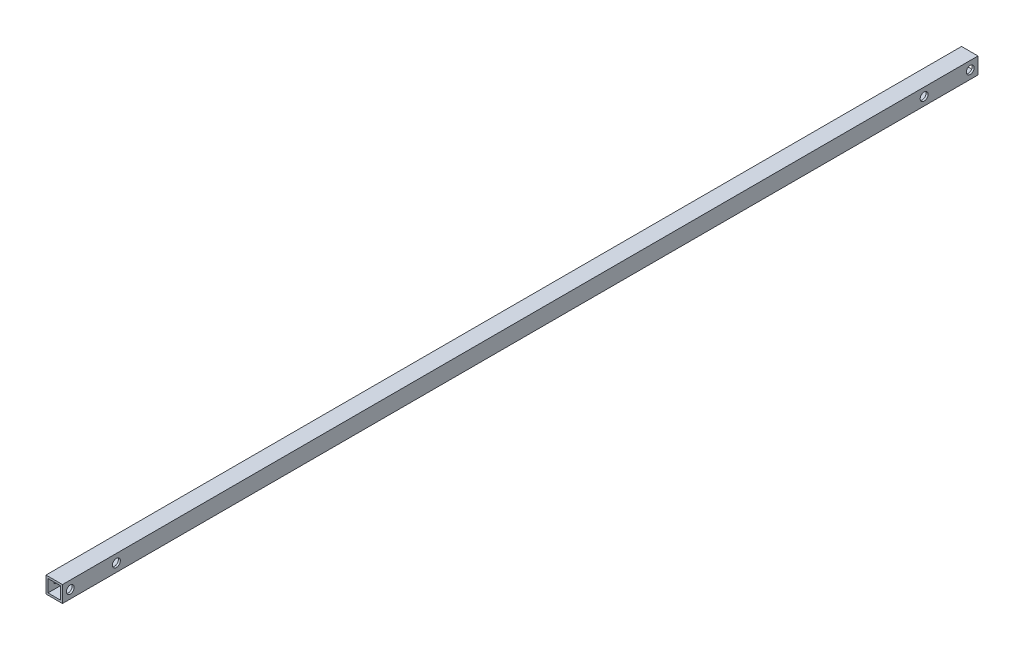
ISO-10303-21;
HEADER;
FILE_DESCRIPTION(('STEP AP214'),'2;1');
FILE_NAME('part.step','',(''),(''),'','','');
FILE_SCHEMA(('AUTOMOTIVE_DESIGN { 1 0 10303 214 1 1 1 1 }'));
ENDSEC;
DATA;
#1=APPLICATION_CONTEXT('core data for automotive mechanical design processes');
#2=APPLICATION_PROTOCOL_DEFINITION('international standard','automotive_design',2000,#1);
#3=PRODUCT_CONTEXT('',#1,'mechanical');
#4=PRODUCT('Part','Part','',(#3));
#5=PRODUCT_RELATED_PRODUCT_CATEGORY('part','',(#4));
#6=PRODUCT_DEFINITION_FORMATION('','',#4);
#7=PRODUCT_DEFINITION_CONTEXT('part definition',#1,'design');
#8=PRODUCT_DEFINITION('design','',#6,#7);
#9=PRODUCT_DEFINITION_SHAPE('','',#8);
#10=(LENGTH_UNIT() NAMED_UNIT(*) SI_UNIT(.MILLI.,.METRE.));
#11=(NAMED_UNIT(*) PLANE_ANGLE_UNIT() SI_UNIT($,.RADIAN.));
#12=(NAMED_UNIT(*) SI_UNIT($,.STERADIAN.) SOLID_ANGLE_UNIT());
#13=UNCERTAINTY_MEASURE_WITH_UNIT(LENGTH_MEASURE(1.E-05),#10,'distance_accuracy_value','');
#14=(GEOMETRIC_REPRESENTATION_CONTEXT(3) GLOBAL_UNCERTAINTY_ASSIGNED_CONTEXT((#13)) GLOBAL_UNIT_ASSIGNED_CONTEXT((#10,
#11,#12)) REPRESENTATION_CONTEXT('',''));
#15=CARTESIAN_POINT('',(0.,0.,0.));
#16=DIRECTION('',(0.,0.,1.));
#17=DIRECTION('',(1.,0.,0.));
#18=AXIS2_PLACEMENT_3D('',#15,#16,#17);
#19=CARTESIAN_POINT('',(0.,-25.,1390.));
#20=DIRECTION('',(0.,0.,1.));
#21=DIRECTION('',(1.,0.,0.));
#22=AXIS2_PLACEMENT_3D('',#19,#20,#21);
#23=PLANE('',#22);
#24=DIRECTION('',(0.,-1.,0.));
#25=VECTOR('',#24,1.);
#26=CARTESIAN_POINT('',(0.,0.,1390.));
#27=LINE('',#26,#25);
#28=CARTESIAN_POINT('',(0.,0.,1390.));
#29=VERTEX_POINT('',#28);
#30=CARTESIAN_POINT('',(0.,-25.,1390.));
#31=VERTEX_POINT('',#30);
#32=EDGE_CURVE('E135',#29,#31,#27,.T.);
#33=ORIENTED_EDGE('',*,*,#32,.T.);
#34=DIRECTION('',(1.,0.,0.));
#35=VECTOR('',#34,1.);
#36=CARTESIAN_POINT('',(0.,-25.,1390.));
#37=LINE('',#36,#35);
#38=CARTESIAN_POINT('',(25.,-25.,1390.));
#39=VERTEX_POINT('',#38);
#40=EDGE_CURVE('E138',#31,#39,#37,.T.);
#41=ORIENTED_EDGE('',*,*,#40,.T.);
#42=DIRECTION('',(0.,1.,0.));
#43=VECTOR('',#42,1.);
#44=CARTESIAN_POINT('',(25.,0.,1390.));
#45=LINE('',#44,#43);
#46=CARTESIAN_POINT('',(25.,0.,1390.));
#47=VERTEX_POINT('',#46);
#48=EDGE_CURVE('E141',#39,#47,#45,.T.);
#49=ORIENTED_EDGE('',*,*,#48,.T.);
#50=DIRECTION('',(-1.,0.,0.));
#51=VECTOR('',#50,1.);
#52=CARTESIAN_POINT('',(0.,0.,1390.));
#53=LINE('',#52,#51);
#54=EDGE_CURVE('E143',#47,#29,#53,.T.);
#55=ORIENTED_EDGE('',*,*,#54,.T.);
#56=EDGE_LOOP('',(#33,#41,#49,#55));
#57=FACE_BOUND('',#56,.T.);
#58=DIRECTION('',(1.,0.,0.));
#59=VECTOR('',#58,1.);
#60=CARTESIAN_POINT('',(3.,-22.,1390.));
#61=LINE('',#60,#59);
#62=CARTESIAN_POINT('',(3.,-22.,1390.));
#63=VERTEX_POINT('',#62);
#64=CARTESIAN_POINT('',(22.,-22.,1390.));
#65=VERTEX_POINT('',#64);
#66=EDGE_CURVE('E105',#63,#65,#61,.T.);
#67=ORIENTED_EDGE('',*,*,#66,.F.);
#68=DIRECTION('',(0.,-1.,0.));
#69=VECTOR('',#68,1.);
#70=CARTESIAN_POINT('',(3.,-3.,1390.));
#71=LINE('',#70,#69);
#72=CARTESIAN_POINT('',(3.,-3.,1390.));
#73=VERTEX_POINT('',#72);
#74=EDGE_CURVE('E97',#73,#63,#71,.T.);
#75=ORIENTED_EDGE('',*,*,#74,.F.);
#76=DIRECTION('',(-1.,0.,0.));
#77=VECTOR('',#76,1.);
#78=CARTESIAN_POINT('',(3.,-3.,1390.));
#79=LINE('',#78,#77);
#80=CARTESIAN_POINT('',(22.,-3.,1390.));
#81=VERTEX_POINT('',#80);
#82=EDGE_CURVE('E119',#81,#73,#79,.T.);
#83=ORIENTED_EDGE('',*,*,#82,.F.);
#84=DIRECTION('',(0.,1.,0.));
#85=VECTOR('',#84,1.);
#86=CARTESIAN_POINT('',(22.,-3.,1390.));
#87=LINE('',#86,#85);
#88=EDGE_CURVE('E117',#65,#81,#87,.T.);
#89=ORIENTED_EDGE('',*,*,#88,.F.);
#90=EDGE_LOOP('',(#67,#75,#83,#89));
#91=FACE_BOUND('',#90,.T.);
#92=ADVANCED_FACE('F32',(#57,#91),#23,.T.);
#93=CARTESIAN_POINT('',(0.,-25.,0.));
#94=DIRECTION('',(0.,0.,1.));
#95=DIRECTION('',(1.,0.,0.));
#96=AXIS2_PLACEMENT_3D('',#93,#94,#95);
#97=PLANE('',#96);
#98=DIRECTION('',(0.,-1.,0.));
#99=VECTOR('',#98,1.);
#100=CARTESIAN_POINT('',(0.,0.,0.));
#101=LINE('',#100,#99);
#102=CARTESIAN_POINT('',(0.,0.,0.));
#103=VERTEX_POINT('',#102);
#104=CARTESIAN_POINT('',(0.,-25.,0.));
#105=VERTEX_POINT('',#104);
#106=EDGE_CURVE('E113',#103,#105,#101,.T.);
#107=ORIENTED_EDGE('',*,*,#106,.F.);
#108=DIRECTION('',(-1.,0.,0.));
#109=VECTOR('',#108,1.);
#110=CARTESIAN_POINT('',(0.,0.,0.));
#111=LINE('',#110,#109);
#112=CARTESIAN_POINT('',(25.,0.,0.));
#113=VERTEX_POINT('',#112);
#114=EDGE_CURVE('E139',#113,#103,#111,.T.);
#115=ORIENTED_EDGE('',*,*,#114,.F.);
#116=DIRECTION('',(0.,1.,0.));
#117=VECTOR('',#116,1.);
#118=CARTESIAN_POINT('',(25.,0.,0.));
#119=LINE('',#118,#117);
#120=CARTESIAN_POINT('',(25.,-25.,0.));
#121=VERTEX_POINT('',#120);
#122=EDGE_CURVE('E150',#121,#113,#119,.T.);
#123=ORIENTED_EDGE('',*,*,#122,.F.);
#124=DIRECTION('',(1.,0.,0.));
#125=VECTOR('',#124,1.);
#126=CARTESIAN_POINT('',(0.,-25.,0.));
#127=LINE('',#126,#125);
#128=EDGE_CURVE('E148',#105,#121,#127,.T.);
#129=ORIENTED_EDGE('',*,*,#128,.F.);
#130=EDGE_LOOP('',(#107,#115,#123,#129));
#131=FACE_BOUND('',#130,.T.);
#132=DIRECTION('',(0.,-1.,0.));
#133=VECTOR('',#132,1.);
#134=CARTESIAN_POINT('',(3.,-3.,0.));
#135=LINE('',#134,#133);
#136=CARTESIAN_POINT('',(3.,-3.,0.));
#137=VERTEX_POINT('',#136);
#138=CARTESIAN_POINT('',(3.,-22.,0.));
#139=VERTEX_POINT('',#138);
#140=EDGE_CURVE('E55',#137,#139,#135,.T.);
#141=ORIENTED_EDGE('',*,*,#140,.T.);
#142=DIRECTION('',(1.,0.,0.));
#143=VECTOR('',#142,1.);
#144=CARTESIAN_POINT('',(3.,-22.,0.));
#145=LINE('',#144,#143);
#146=CARTESIAN_POINT('',(22.,-22.,0.));
#147=VERTEX_POINT('',#146);
#148=EDGE_CURVE('E112',#139,#147,#145,.T.);
#149=ORIENTED_EDGE('',*,*,#148,.T.);
#150=DIRECTION('',(0.,1.,0.));
#151=VECTOR('',#150,1.);
#152=CARTESIAN_POINT('',(22.,-3.,0.));
#153=LINE('',#152,#151);
#154=CARTESIAN_POINT('',(22.,-3.,0.));
#155=VERTEX_POINT('',#154);
#156=EDGE_CURVE('E127',#147,#155,#153,.T.);
#157=ORIENTED_EDGE('',*,*,#156,.T.);
#158=DIRECTION('',(-1.,0.,0.));
#159=VECTOR('',#158,1.);
#160=CARTESIAN_POINT('',(3.,-3.,0.));
#161=LINE('',#160,#159);
#162=EDGE_CURVE('E106',#155,#137,#161,.T.);
#163=ORIENTED_EDGE('',*,*,#162,.T.);
#164=EDGE_LOOP('',(#141,#149,#157,#163));
#165=FACE_BOUND('',#164,.T.);
#166=ADVANCED_FACE('F168',(#131,#165),#97,.F.);
#167=CARTESIAN_POINT('',(0.,0.,1390.));
#168=DIRECTION('',(1.,0.,0.));
#169=DIRECTION('',(0.,1.,0.));
#170=AXIS2_PLACEMENT_3D('',#167,#168,#169);
#171=PLANE('',#170);
#172=CARTESIAN_POINT('',(0.,-12.5,1378.14));
#173=DIRECTION('',(-1.,0.,0.));
#174=DIRECTION('',(0.,0.,1.));
#175=AXIS2_PLACEMENT_3D('',#172,#173,#174);
#176=CIRCLE('',#175,3.);
#177=CARTESIAN_POINT('',(0.,-12.5,1381.14));
#178=VERTEX_POINT('',#177);
#179=EDGE_CURVE('E244',#178,#178,#176,.T.);
#180=ORIENTED_EDGE('',*,*,#179,.F.);
#181=EDGE_LOOP('',(#180));
#182=FACE_BOUND('',#181,.T.);
#183=CARTESIAN_POINT('',(0.,-12.5,1308.14));
#184=DIRECTION('',(-1.,0.,0.));
#185=DIRECTION('',(0.,0.,1.));
#186=AXIS2_PLACEMENT_3D('',#183,#184,#185);
#187=CIRCLE('',#186,3.);
#188=CARTESIAN_POINT('',(0.,-12.5,1311.14));
#189=VERTEX_POINT('',#188);
#190=EDGE_CURVE('E238',#189,#189,#187,.T.);
#191=ORIENTED_EDGE('',*,*,#190,.F.);
#192=EDGE_LOOP('',(#191));
#193=FACE_BOUND('',#192,.T.);
#194=CARTESIAN_POINT('',(0.,-12.5,11.8));
#195=DIRECTION('',(-1.,0.,0.));
#196=DIRECTION('',(0.,0.,1.));
#197=AXIS2_PLACEMENT_3D('',#194,#195,#196);
#198=CIRCLE('',#197,3.);
#199=CARTESIAN_POINT('',(0.,-12.5,14.8));
#200=VERTEX_POINT('',#199);
#201=EDGE_CURVE('E225',#200,#200,#198,.T.);
#202=ORIENTED_EDGE('',*,*,#201,.F.);
#203=EDGE_LOOP('',(#202));
#204=FACE_BOUND('',#203,.T.);
#205=CARTESIAN_POINT('',(0.,-12.5,81.8));
#206=DIRECTION('',(-1.,0.,0.));
#207=DIRECTION('',(0.,0.,1.));
#208=AXIS2_PLACEMENT_3D('',#205,#206,#207);
#209=CIRCLE('',#208,3.);
#210=CARTESIAN_POINT('',(0.,-12.5,84.8));
#211=VERTEX_POINT('',#210);
#212=EDGE_CURVE('E220',#211,#211,#209,.T.);
#213=ORIENTED_EDGE('',*,*,#212,.F.);
#214=EDGE_LOOP('',(#213));
#215=FACE_BOUND('',#214,.T.);
#216=ORIENTED_EDGE('',*,*,#106,.T.);
#217=DIRECTION('',(0.,0.,-1.));
#218=VECTOR('',#217,1.);
#219=CARTESIAN_POINT('',(0.,-25.,1390.));
#220=LINE('',#219,#218);
#221=EDGE_CURVE('E11',#31,#105,#220,.T.);
#222=ORIENTED_EDGE('',*,*,#221,.F.);
#223=ORIENTED_EDGE('',*,*,#32,.F.);
#224=DIRECTION('',(0.,0.,-1.));
#225=VECTOR('',#224,1.);
#226=CARTESIAN_POINT('',(0.,0.,1390.));
#227=LINE('',#226,#225);
#228=EDGE_CURVE('E145',#29,#103,#227,.T.);
#229=ORIENTED_EDGE('',*,*,#228,.T.);
#230=EDGE_LOOP('',(#216,#222,#223,#229));
#231=FACE_BOUND('',#230,.T.);
#232=ADVANCED_FACE('F34',(#182,#193,#204,#215,#231),#171,.F.);
#233=CARTESIAN_POINT('',(0.,-25.,1390.));
#234=DIRECTION('',(0.,1.,0.));
#235=DIRECTION('',(0.,0.,1.));
#236=AXIS2_PLACEMENT_3D('',#233,#234,#235);
#237=PLANE('',#236);
#238=ORIENTED_EDGE('',*,*,#128,.T.);
#239=DIRECTION('',(0.,0.,-1.));
#240=VECTOR('',#239,1.);
#241=CARTESIAN_POINT('',(25.,-25.,1390.));
#242=LINE('',#241,#240);
#243=EDGE_CURVE('E40',#39,#121,#242,.T.);
#244=ORIENTED_EDGE('',*,*,#243,.F.);
#245=ORIENTED_EDGE('',*,*,#40,.F.);
#246=ORIENTED_EDGE('',*,*,#221,.T.);
#247=EDGE_LOOP('',(#238,#244,#245,#246));
#248=FACE_BOUND('',#247,.T.);
#249=ADVANCED_FACE('F178',(#248),#237,.F.);
#250=CARTESIAN_POINT('',(25.,0.,1390.));
#251=DIRECTION('',(-1.,0.,0.));
#252=DIRECTION('',(0.,-1.,0.));
#253=AXIS2_PLACEMENT_3D('',#250,#251,#252);
#254=PLANE('',#253);
#255=CARTESIAN_POINT('',(25.,-12.5,1378.14));
#256=DIRECTION('',(1.,0.,0.));
#257=DIRECTION('',(0.,1.,0.));
#258=AXIS2_PLACEMENT_3D('',#255,#256,#257);
#259=CIRCLE('',#258,6.);
#260=CARTESIAN_POINT('',(25.,-6.5,1378.14));
#261=VERTEX_POINT('',#260);
#262=EDGE_CURVE('E252',#261,#261,#259,.T.);
#263=ORIENTED_EDGE('',*,*,#262,.F.);
#264=EDGE_LOOP('',(#263));
#265=FACE_BOUND('',#264,.T.);
#266=CARTESIAN_POINT('',(25.,-12.5,1308.14));
#267=DIRECTION('',(1.,0.,0.));
#268=DIRECTION('',(0.,1.,0.));
#269=AXIS2_PLACEMENT_3D('',#266,#267,#268);
#270=CIRCLE('',#269,6.);
#271=CARTESIAN_POINT('',(25.,-6.5,1308.14));
#272=VERTEX_POINT('',#271);
#273=EDGE_CURVE('E248',#272,#272,#270,.T.);
#274=ORIENTED_EDGE('',*,*,#273,.F.);
#275=EDGE_LOOP('',(#274));
#276=FACE_BOUND('',#275,.T.);
#277=CARTESIAN_POINT('',(25.,-12.5,81.8));
#278=DIRECTION('',(1.,0.,0.));
#279=DIRECTION('',(0.,1.,0.));
#280=AXIS2_PLACEMENT_3D('',#277,#278,#279);
#281=CIRCLE('',#280,6.);
#282=CARTESIAN_POINT('',(25.,-6.5,81.8));
#283=VERTEX_POINT('',#282);
#284=EDGE_CURVE('E232',#283,#283,#281,.T.);
#285=ORIENTED_EDGE('',*,*,#284,.F.);
#286=EDGE_LOOP('',(#285));
#287=FACE_BOUND('',#286,.T.);
#288=CARTESIAN_POINT('',(25.,-12.5,11.8));
#289=DIRECTION('',(1.,0.,0.));
#290=DIRECTION('',(0.,1.,0.));
#291=AXIS2_PLACEMENT_3D('',#288,#289,#290);
#292=CIRCLE('',#291,6.);
#293=CARTESIAN_POINT('',(25.,-6.5,11.8));
#294=VERTEX_POINT('',#293);
#295=EDGE_CURVE('E228',#294,#294,#292,.T.);
#296=ORIENTED_EDGE('',*,*,#295,.F.);
#297=EDGE_LOOP('',(#296));
#298=FACE_BOUND('',#297,.T.);
#299=ORIENTED_EDGE('',*,*,#122,.T.);
#300=DIRECTION('',(0.,0.,-1.));
#301=VECTOR('',#300,1.);
#302=CARTESIAN_POINT('',(25.,0.,1390.));
#303=LINE('',#302,#301);
#304=EDGE_CURVE('E155',#47,#113,#303,.T.);
#305=ORIENTED_EDGE('',*,*,#304,.F.);
#306=ORIENTED_EDGE('',*,*,#48,.F.);
#307=ORIENTED_EDGE('',*,*,#243,.T.);
#308=EDGE_LOOP('',(#299,#305,#306,#307));
#309=FACE_BOUND('',#308,.T.);
#310=ADVANCED_FACE('F162',(#265,#276,#287,#298,#309),#254,.F.);
#311=CARTESIAN_POINT('',(0.,0.,1390.));
#312=DIRECTION('',(0.,-1.,0.));
#313=DIRECTION('',(0.,0.,-1.));
#314=AXIS2_PLACEMENT_3D('',#311,#312,#313);
#315=PLANE('',#314);
#316=ORIENTED_EDGE('',*,*,#114,.T.);
#317=ORIENTED_EDGE('',*,*,#228,.F.);
#318=ORIENTED_EDGE('',*,*,#54,.F.);
#319=ORIENTED_EDGE('',*,*,#304,.T.);
#320=EDGE_LOOP('',(#316,#317,#318,#319));
#321=FACE_BOUND('',#320,.T.);
#322=ADVANCED_FACE('F172',(#321),#315,.F.);
#323=CARTESIAN_POINT('',(3.,-3.,1390.));
#324=DIRECTION('',(1.,0.,0.));
#325=DIRECTION('',(0.,1.,0.));
#326=AXIS2_PLACEMENT_3D('',#323,#324,#325);
#327=PLANE('',#326);
#328=CARTESIAN_POINT('',(3.,-12.5,1378.14));
#329=DIRECTION('',(1.,0.,0.));
#330=DIRECTION('',(0.,1.,0.));
#331=AXIS2_PLACEMENT_3D('',#328,#329,#330);
#332=CIRCLE('',#331,2.99999999999999);
#333=CARTESIAN_POINT('',(3.,-9.50000000000001,1378.14));
#334=VERTEX_POINT('',#333);
#335=EDGE_CURVE('E208',#334,#334,#332,.T.);
#336=ORIENTED_EDGE('',*,*,#335,.F.);
#337=EDGE_LOOP('',(#336));
#338=FACE_BOUND('',#337,.T.);
#339=CARTESIAN_POINT('',(3.,-12.5,1308.14));
#340=DIRECTION('',(1.,0.,0.));
#341=DIRECTION('',(0.,1.,0.));
#342=AXIS2_PLACEMENT_3D('',#339,#340,#341);
#343=CIRCLE('',#342,2.99999999999999);
#344=CARTESIAN_POINT('',(3.,-9.50000000000001,1308.14));
#345=VERTEX_POINT('',#344);
#346=EDGE_CURVE('E212',#345,#345,#343,.T.);
#347=ORIENTED_EDGE('',*,*,#346,.F.);
#348=EDGE_LOOP('',(#347));
#349=FACE_BOUND('',#348,.T.);
#350=CARTESIAN_POINT('',(3.,-12.5,11.8));
#351=DIRECTION('',(1.,0.,0.));
#352=DIRECTION('',(0.,1.,0.));
#353=AXIS2_PLACEMENT_3D('',#350,#351,#352);
#354=CIRCLE('',#353,2.99999999999999);
#355=CARTESIAN_POINT('',(3.,-9.50000000000001,11.8));
#356=VERTEX_POINT('',#355);
#357=EDGE_CURVE('E216',#356,#356,#354,.T.);
#358=ORIENTED_EDGE('',*,*,#357,.F.);
#359=EDGE_LOOP('',(#358));
#360=FACE_BOUND('',#359,.T.);
#361=CARTESIAN_POINT('',(3.,-12.5,81.8));
#362=DIRECTION('',(1.,0.,0.));
#363=DIRECTION('',(0.,1.,0.));
#364=AXIS2_PLACEMENT_3D('',#361,#362,#363);
#365=CIRCLE('',#364,2.99999999999999);
#366=CARTESIAN_POINT('',(3.,-9.50000000000001,81.8));
#367=VERTEX_POINT('',#366);
#368=EDGE_CURVE('E125',#367,#367,#365,.T.);
#369=ORIENTED_EDGE('',*,*,#368,.F.);
#370=EDGE_LOOP('',(#369));
#371=FACE_BOUND('',#370,.T.);
#372=ORIENTED_EDGE('',*,*,#140,.F.);
#373=DIRECTION('',(0.,0.,-1.));
#374=VECTOR('',#373,1.);
#375=CARTESIAN_POINT('',(3.,-3.,1390.));
#376=LINE('',#375,#374);
#377=EDGE_CURVE('E101',#73,#137,#376,.T.);
#378=ORIENTED_EDGE('',*,*,#377,.F.);
#379=ORIENTED_EDGE('',*,*,#74,.T.);
#380=DIRECTION('',(0.,0.,-1.));
#381=VECTOR('',#380,1.);
#382=CARTESIAN_POINT('',(3.,-22.,1390.));
#383=LINE('',#382,#381);
#384=EDGE_CURVE('E100',#63,#139,#383,.T.);
#385=ORIENTED_EDGE('',*,*,#384,.T.);
#386=EDGE_LOOP('',(#372,#378,#379,#385));
#387=FACE_BOUND('',#386,.T.);
#388=ADVANCED_FACE('F99',(#338,#349,#360,#371,#387),#327,.T.);
#389=CARTESIAN_POINT('',(3.,-22.,1390.));
#390=DIRECTION('',(0.,1.,0.));
#391=DIRECTION('',(0.,0.,1.));
#392=AXIS2_PLACEMENT_3D('',#389,#390,#391);
#393=PLANE('',#392);
#394=ORIENTED_EDGE('',*,*,#148,.F.);
#395=ORIENTED_EDGE('',*,*,#384,.F.);
#396=ORIENTED_EDGE('',*,*,#66,.T.);
#397=DIRECTION('',(0.,0.,-1.));
#398=VECTOR('',#397,1.);
#399=CARTESIAN_POINT('',(22.,-22.,1390.));
#400=LINE('',#399,#398);
#401=EDGE_CURVE('E114',#65,#147,#400,.T.);
#402=ORIENTED_EDGE('',*,*,#401,.T.);
#403=EDGE_LOOP('',(#394,#395,#396,#402));
#404=FACE_BOUND('',#403,.T.);
#405=ADVANCED_FACE('F109',(#404),#393,.T.);
#406=CARTESIAN_POINT('',(22.,-3.,1390.));
#407=DIRECTION('',(-1.,0.,0.));
#408=DIRECTION('',(0.,-1.,0.));
#409=AXIS2_PLACEMENT_3D('',#406,#407,#408);
#410=PLANE('',#409);
#411=CARTESIAN_POINT('',(22.,-12.5,1378.14));
#412=DIRECTION('',(-1.,0.,0.));
#413=DIRECTION('',(0.,-1.,0.));
#414=AXIS2_PLACEMENT_3D('',#411,#412,#413);
#415=CIRCLE('',#414,6.);
#416=CARTESIAN_POINT('',(22.,-18.5,1378.14));
#417=VERTEX_POINT('',#416);
#418=EDGE_CURVE('E255',#417,#417,#415,.F.);
#419=ORIENTED_EDGE('',*,*,#418,.T.);
#420=EDGE_LOOP('',(#419));
#421=FACE_BOUND('',#420,.T.);
#422=CARTESIAN_POINT('',(22.,-12.5,1308.14));
#423=DIRECTION('',(-1.,0.,0.));
#424=DIRECTION('',(0.,-1.,0.));
#425=AXIS2_PLACEMENT_3D('',#422,#423,#424);
#426=CIRCLE('',#425,6.);
#427=CARTESIAN_POINT('',(22.,-18.5,1308.14));
#428=VERTEX_POINT('',#427);
#429=EDGE_CURVE('E249',#428,#428,#426,.F.);
#430=ORIENTED_EDGE('',*,*,#429,.T.);
#431=EDGE_LOOP('',(#430));
#432=FACE_BOUND('',#431,.T.);
#433=CARTESIAN_POINT('',(22.,-12.5,81.8));
#434=DIRECTION('',(-1.,0.,0.));
#435=DIRECTION('',(0.,-1.,0.));
#436=AXIS2_PLACEMENT_3D('',#433,#434,#435);
#437=CIRCLE('',#436,6.);
#438=CARTESIAN_POINT('',(22.,-18.5,81.8));
#439=VERTEX_POINT('',#438);
#440=EDGE_CURVE('E235',#439,#439,#437,.F.);
#441=ORIENTED_EDGE('',*,*,#440,.T.);
#442=EDGE_LOOP('',(#441));
#443=FACE_BOUND('',#442,.T.);
#444=CARTESIAN_POINT('',(22.,-12.5,11.8));
#445=DIRECTION('',(-1.,0.,0.));
#446=DIRECTION('',(0.,-1.,0.));
#447=AXIS2_PLACEMENT_3D('',#444,#445,#446);
#448=CIRCLE('',#447,6.);
#449=CARTESIAN_POINT('',(22.,-18.5,11.8));
#450=VERTEX_POINT('',#449);
#451=EDGE_CURVE('E229',#450,#450,#448,.F.);
#452=ORIENTED_EDGE('',*,*,#451,.T.);
#453=EDGE_LOOP('',(#452));
#454=FACE_BOUND('',#453,.T.);
#455=ORIENTED_EDGE('',*,*,#156,.F.);
#456=ORIENTED_EDGE('',*,*,#401,.F.);
#457=ORIENTED_EDGE('',*,*,#88,.T.);
#458=DIRECTION('',(0.,0.,-1.));
#459=VECTOR('',#458,1.);
#460=CARTESIAN_POINT('',(22.,-3.,1390.));
#461=LINE('',#460,#459);
#462=EDGE_CURVE('E47',#81,#155,#461,.T.);
#463=ORIENTED_EDGE('',*,*,#462,.T.);
#464=EDGE_LOOP('',(#455,#456,#457,#463));
#465=FACE_BOUND('',#464,.T.);
#466=ADVANCED_FACE('F204',(#421,#432,#443,#454,#465),#410,.T.);
#467=CARTESIAN_POINT('',(3.,-3.,1390.));
#468=DIRECTION('',(0.,-1.,0.));
#469=DIRECTION('',(0.,0.,-1.));
#470=AXIS2_PLACEMENT_3D('',#467,#468,#469);
#471=PLANE('',#470);
#472=ORIENTED_EDGE('',*,*,#162,.F.);
#473=ORIENTED_EDGE('',*,*,#462,.F.);
#474=ORIENTED_EDGE('',*,*,#82,.T.);
#475=ORIENTED_EDGE('',*,*,#377,.T.);
#476=EDGE_LOOP('',(#472,#473,#474,#475));
#477=FACE_BOUND('',#476,.T.);
#478=ADVANCED_FACE('F290',(#477),#471,.T.);
#479=CARTESIAN_POINT('',(0.,-12.5,81.8));
#480=DIRECTION('',(-1.,0.,0.));
#481=DIRECTION('',(0.,0.,1.));
#482=AXIS2_PLACEMENT_3D('',#479,#480,#481);
#483=CYLINDRICAL_SURFACE('',#482,2.99999999999999);
#484=ORIENTED_EDGE('',*,*,#368,.T.);
#485=EDGE_LOOP('',(#484));
#486=FACE_BOUND('',#485,.T.);
#487=ORIENTED_EDGE('',*,*,#212,.T.);
#488=EDGE_LOOP('',(#487));
#489=FACE_BOUND('',#488,.T.);
#490=ADVANCED_FACE('F282',(#486,#489),#483,.F.);
#491=CARTESIAN_POINT('',(0.,-12.5,11.8));
#492=DIRECTION('',(-1.,0.,0.));
#493=DIRECTION('',(0.,0.,1.));
#494=AXIS2_PLACEMENT_3D('',#491,#492,#493);
#495=CYLINDRICAL_SURFACE('',#494,2.99999999999999);
#496=ORIENTED_EDGE('',*,*,#357,.T.);
#497=EDGE_LOOP('',(#496));
#498=FACE_BOUND('',#497,.T.);
#499=ORIENTED_EDGE('',*,*,#201,.T.);
#500=EDGE_LOOP('',(#499));
#501=FACE_BOUND('',#500,.T.);
#502=ADVANCED_FACE('F272',(#498,#501),#495,.F.);
#503=CARTESIAN_POINT('',(-0.00100000000000447,-12.5,11.8));
#504=DIRECTION('',(1.,0.,0.));
#505=DIRECTION('',(0.,1.,0.));
#506=AXIS2_PLACEMENT_3D('',#503,#504,#505);
#507=CYLINDRICAL_SURFACE('',#506,6.);
#508=ORIENTED_EDGE('',*,*,#451,.F.);
#509=EDGE_LOOP('',(#508));
#510=FACE_BOUND('',#509,.T.);
#511=ORIENTED_EDGE('',*,*,#295,.T.);
#512=EDGE_LOOP('',(#511));
#513=FACE_BOUND('',#512,.T.);
#514=ADVANCED_FACE('F269',(#510,#513),#507,.F.);
#515=CARTESIAN_POINT('',(-0.00100000000000447,-12.5,81.8));
#516=DIRECTION('',(1.,0.,0.));
#517=DIRECTION('',(0.,1.,0.));
#518=AXIS2_PLACEMENT_3D('',#515,#516,#517);
#519=CYLINDRICAL_SURFACE('',#518,6.);
#520=ORIENTED_EDGE('',*,*,#440,.F.);
#521=EDGE_LOOP('',(#520));
#522=FACE_BOUND('',#521,.T.);
#523=ORIENTED_EDGE('',*,*,#284,.T.);
#524=EDGE_LOOP('',(#523));
#525=FACE_BOUND('',#524,.T.);
#526=ADVANCED_FACE('F271',(#522,#525),#519,.F.);
#527=CARTESIAN_POINT('',(0.,-12.5,1308.14));
#528=DIRECTION('',(-1.,0.,0.));
#529=DIRECTION('',(0.,0.,1.));
#530=AXIS2_PLACEMENT_3D('',#527,#528,#529);
#531=CYLINDRICAL_SURFACE('',#530,2.99999999999999);
#532=ORIENTED_EDGE('',*,*,#346,.T.);
#533=EDGE_LOOP('',(#532));
#534=FACE_BOUND('',#533,.T.);
#535=ORIENTED_EDGE('',*,*,#190,.T.);
#536=EDGE_LOOP('',(#535));
#537=FACE_BOUND('',#536,.T.);
#538=ADVANCED_FACE('F279',(#534,#537),#531,.F.);
#539=CARTESIAN_POINT('',(0.,-12.5,1378.14));
#540=DIRECTION('',(-1.,0.,0.));
#541=DIRECTION('',(0.,0.,1.));
#542=AXIS2_PLACEMENT_3D('',#539,#540,#541);
#543=CYLINDRICAL_SURFACE('',#542,2.99999999999999);
#544=ORIENTED_EDGE('',*,*,#335,.T.);
#545=EDGE_LOOP('',(#544));
#546=FACE_BOUND('',#545,.T.);
#547=ORIENTED_EDGE('',*,*,#179,.T.);
#548=EDGE_LOOP('',(#547));
#549=FACE_BOUND('',#548,.T.);
#550=ADVANCED_FACE('F310',(#546,#549),#543,.F.);
#551=CARTESIAN_POINT('',(-0.00100000000000447,-12.5,1308.14));
#552=DIRECTION('',(1.,0.,0.));
#553=DIRECTION('',(0.,1.,0.));
#554=AXIS2_PLACEMENT_3D('',#551,#552,#553);
#555=CYLINDRICAL_SURFACE('',#554,6.);
#556=ORIENTED_EDGE('',*,*,#429,.F.);
#557=EDGE_LOOP('',(#556));
#558=FACE_BOUND('',#557,.T.);
#559=ORIENTED_EDGE('',*,*,#273,.T.);
#560=EDGE_LOOP('',(#559));
#561=FACE_BOUND('',#560,.T.);
#562=ADVANCED_FACE('F307',(#558,#561),#555,.F.);
#563=CARTESIAN_POINT('',(-0.00100000000000447,-12.5,1378.14));
#564=DIRECTION('',(1.,0.,0.));
#565=DIRECTION('',(0.,1.,0.));
#566=AXIS2_PLACEMENT_3D('',#563,#564,#565);
#567=CYLINDRICAL_SURFACE('',#566,6.);
#568=ORIENTED_EDGE('',*,*,#418,.F.);
#569=EDGE_LOOP('',(#568));
#570=FACE_BOUND('',#569,.T.);
#571=ORIENTED_EDGE('',*,*,#262,.T.);
#572=EDGE_LOOP('',(#571));
#573=FACE_BOUND('',#572,.T.);
#574=ADVANCED_FACE('F261',(#570,#573),#567,.F.);
#575=CLOSED_SHELL('',(#92,#166,#232,#249,#310,#322,#388,#405,#466,#478,#490,#502,#514,#526,#538,
#550,#562,#574));
#576=MANIFOLD_SOLID_BREP('B2',#575);
#577=ADVANCED_BREP_SHAPE_REPRESENTATION('',(#18,#576),#14);
#578=SHAPE_DEFINITION_REPRESENTATION(#9,#577);
ENDSEC;
END-ISO-10303-21;
